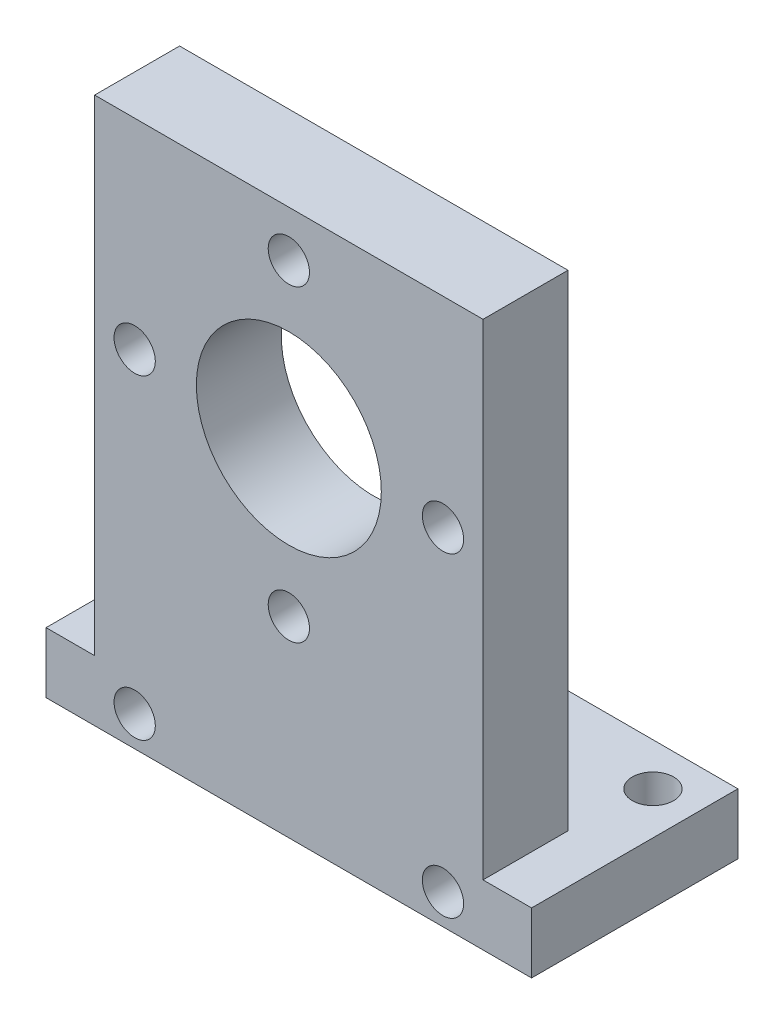
ISO-10303-21;
HEADER;
FILE_DESCRIPTION(('STEP AP214'),'2;1');
FILE_NAME('part.step','',(''),(''),'','','');
FILE_SCHEMA(('AUTOMOTIVE_DESIGN { 1 0 10303 214 1 1 1 1 }'));
ENDSEC;
DATA;
#1=APPLICATION_CONTEXT('core data for automotive mechanical design processes');
#2=APPLICATION_PROTOCOL_DEFINITION('international standard','automotive_design',2000,#1);
#3=PRODUCT_CONTEXT('',#1,'mechanical');
#4=PRODUCT('Part','Part','',(#3));
#5=PRODUCT_RELATED_PRODUCT_CATEGORY('part','',(#4));
#6=PRODUCT_DEFINITION_FORMATION('','',#4);
#7=PRODUCT_DEFINITION_CONTEXT('part definition',#1,'design');
#8=PRODUCT_DEFINITION('design','',#6,#7);
#9=PRODUCT_DEFINITION_SHAPE('','',#8);
#10=(LENGTH_UNIT() NAMED_UNIT(*) SI_UNIT(.MILLI.,.METRE.));
#11=(NAMED_UNIT(*) PLANE_ANGLE_UNIT() SI_UNIT($,.RADIAN.));
#12=(NAMED_UNIT(*) SI_UNIT($,.STERADIAN.) SOLID_ANGLE_UNIT());
#13=UNCERTAINTY_MEASURE_WITH_UNIT(LENGTH_MEASURE(1.E-05),#10,'distance_accuracy_value','');
#14=(GEOMETRIC_REPRESENTATION_CONTEXT(3) GLOBAL_UNCERTAINTY_ASSIGNED_CONTEXT((#13)) GLOBAL_UNIT_ASSIGNED_CONTEXT((#10,
#11,#12)) REPRESENTATION_CONTEXT('',''));
#15=CARTESIAN_POINT('',(0.,0.,0.));
#16=DIRECTION('',(0.,0.,1.));
#17=DIRECTION('',(1.,0.,0.));
#18=AXIS2_PLACEMENT_3D('',#15,#16,#17);
#19=CARTESIAN_POINT('',(-20.,5.,-13.5));
#20=DIRECTION('',(0.,0.,1.));
#21=DIRECTION('',(-1.,0.,0.));
#22=AXIS2_PLACEMENT_3D('',#19,#20,#21);
#23=PLANE('',#22);
#24=DIRECTION('',(1.,0.,0.));
#25=VECTOR('',#24,1.);
#26=CARTESIAN_POINT('',(-20.,0.,-13.5));
#27=LINE('',#26,#25);
#28=CARTESIAN_POINT('',(-20.,0.,-13.5));
#29=VERTEX_POINT('',#28);
#30=CARTESIAN_POINT('',(20.,0.,-13.5));
#31=VERTEX_POINT('',#30);
#32=EDGE_CURVE('E106',#29,#31,#27,.T.);
#33=ORIENTED_EDGE('',*,*,#32,.F.);
#34=DIRECTION('',(0.,-1.,0.));
#35=VECTOR('',#34,1.);
#36=CARTESIAN_POINT('',(-20.,5.,-13.5));
#37=LINE('',#36,#35);
#38=CARTESIAN_POINT('',(-20.,5.,-13.5));
#39=VERTEX_POINT('',#38);
#40=EDGE_CURVE('E70',#39,#29,#37,.T.);
#41=ORIENTED_EDGE('',*,*,#40,.F.);
#42=DIRECTION('',(1.,0.,0.));
#43=VECTOR('',#42,1.);
#44=CARTESIAN_POINT('',(-20.,5.,-13.5));
#45=LINE('',#44,#43);
#46=CARTESIAN_POINT('',(20.,5.,-13.5));
#47=VERTEX_POINT('',#46);
#48=EDGE_CURVE('E111',#39,#47,#45,.T.);
#49=ORIENTED_EDGE('',*,*,#48,.T.);
#50=DIRECTION('',(0.,-1.,0.));
#51=VECTOR('',#50,1.);
#52=CARTESIAN_POINT('',(20.,5.,-13.5));
#53=LINE('',#52,#51);
#54=EDGE_CURVE('E12',#47,#31,#53,.T.);
#55=ORIENTED_EDGE('',*,*,#54,.T.);
#56=EDGE_LOOP('',(#33,#41,#49,#55));
#57=FACE_BOUND('',#56,.T.);
#58=ADVANCED_FACE('F63',(#57),#23,.F.);
#59=CARTESIAN_POINT('',(20.,5.,13.5));
#60=DIRECTION('',(1.,0.,0.));
#61=DIRECTION('',(0.,0.,1.));
#62=AXIS2_PLACEMENT_3D('',#59,#60,#61);
#63=PLANE('',#62);
#64=DIRECTION('',(0.,1.,0.));
#65=VECTOR('',#64,1.);
#66=CARTESIAN_POINT('',(20.,-0.00100000000000013,3.5));
#67=LINE('',#66,#65);
#68=CARTESIAN_POINT('',(20.,0.,3.5));
#69=VERTEX_POINT('',#68);
#70=CARTESIAN_POINT('',(20.,5.,3.5));
#71=VERTEX_POINT('',#70);
#72=EDGE_CURVE('E199',#69,#71,#67,.T.);
#73=ORIENTED_EDGE('',*,*,#72,.F.);
#74=DIRECTION('',(0.,0.,-1.));
#75=VECTOR('',#74,1.);
#76=CARTESIAN_POINT('',(20.,0.,13.5));
#77=LINE('',#76,#75);
#78=EDGE_CURVE('E112',#69,#31,#77,.T.);
#79=ORIENTED_EDGE('',*,*,#78,.T.);
#80=ORIENTED_EDGE('',*,*,#54,.F.);
#81=DIRECTION('',(0.,0.,-1.));
#82=VECTOR('',#81,1.);
#83=CARTESIAN_POINT('',(20.,5.,13.5));
#84=LINE('',#83,#82);
#85=EDGE_CURVE('E127',#71,#47,#84,.T.);
#86=ORIENTED_EDGE('',*,*,#85,.F.);
#87=EDGE_LOOP('',(#73,#79,#80,#86));
#88=FACE_BOUND('',#87,.T.);
#89=ADVANCED_FACE('F236',(#88),#63,.T.);
#90=CARTESIAN_POINT('',(-20.,5.,13.5));
#91=DIRECTION('',(1.,0.,0.));
#92=DIRECTION('',(0.,0.,1.));
#93=AXIS2_PLACEMENT_3D('',#90,#91,#92);
#94=PLANE('',#93);
#95=DIRECTION('',(0.,0.,-1.));
#96=VECTOR('',#95,1.);
#97=CARTESIAN_POINT('',(-20.,5.,13.5));
#98=LINE('',#97,#96);
#99=CARTESIAN_POINT('',(-20.,5.,3.5));
#100=VERTEX_POINT('',#99);
#101=EDGE_CURVE('E86',#100,#39,#98,.T.);
#102=ORIENTED_EDGE('',*,*,#101,.T.);
#103=ORIENTED_EDGE('',*,*,#40,.T.);
#104=DIRECTION('',(0.,0.,-1.));
#105=VECTOR('',#104,1.);
#106=CARTESIAN_POINT('',(-20.,0.,13.5));
#107=LINE('',#106,#105);
#108=CARTESIAN_POINT('',(-20.,0.,3.5));
#109=VERTEX_POINT('',#108);
#110=EDGE_CURVE('E101',#109,#29,#107,.T.);
#111=ORIENTED_EDGE('',*,*,#110,.F.);
#112=DIRECTION('',(0.,1.,0.));
#113=VECTOR('',#112,1.);
#114=CARTESIAN_POINT('',(-20.,-0.00100000000000013,3.5));
#115=LINE('',#114,#113);
#116=EDGE_CURVE('E200',#109,#100,#115,.T.);
#117=ORIENTED_EDGE('',*,*,#116,.T.);
#118=EDGE_LOOP('',(#102,#103,#111,#117));
#119=FACE_BOUND('',#118,.T.);
#120=ADVANCED_FACE('F115',(#119),#94,.F.);
#121=CARTESIAN_POINT('',(0.,5.,0.));
#122=DIRECTION('',(0.,-1.,0.));
#123=DIRECTION('',(0.,0.,1.));
#124=AXIS2_PLACEMENT_3D('',#121,#122,#123);
#125=PLANE('',#124);
#126=CARTESIAN_POINT('',(16.5,5.,-10.));
#127=DIRECTION('',(0.,-1.,0.));
#128=DIRECTION('',(0.,0.,1.));
#129=AXIS2_PLACEMENT_3D('',#126,#127,#128);
#130=CIRCLE('',#129,1.7);
#131=CARTESIAN_POINT('',(16.5,5.,-8.3));
#132=VERTEX_POINT('',#131);
#133=EDGE_CURVE('E187',#132,#132,#130,.T.);
#134=ORIENTED_EDGE('',*,*,#133,.T.);
#135=EDGE_LOOP('',(#134));
#136=FACE_BOUND('',#135,.T.);
#137=CARTESIAN_POINT('',(-16.5,5.,-10.));
#138=DIRECTION('',(0.,-1.,0.));
#139=DIRECTION('',(0.,0.,-1.));
#140=AXIS2_PLACEMENT_3D('',#137,#138,#139);
#141=CIRCLE('',#140,1.7);
#142=CARTESIAN_POINT('',(-16.5,5.,-11.7));
#143=VERTEX_POINT('',#142);
#144=EDGE_CURVE('E193',#143,#143,#141,.T.);
#145=ORIENTED_EDGE('',*,*,#144,.T.);
#146=EDGE_LOOP('',(#145));
#147=FACE_BOUND('',#146,.T.);
#148=ORIENTED_EDGE('',*,*,#85,.T.);
#149=ORIENTED_EDGE('',*,*,#48,.F.);
#150=ORIENTED_EDGE('',*,*,#101,.F.);
#151=DIRECTION('',(1.,0.,0.));
#152=VECTOR('',#151,1.);
#153=CARTESIAN_POINT('',(-20.,5.,3.5));
#154=LINE('',#153,#152);
#155=CARTESIAN_POINT('',(-16.,5.,3.5));
#156=VERTEX_POINT('',#155);
#157=EDGE_CURVE('E202',#100,#156,#154,.T.);
#158=ORIENTED_EDGE('',*,*,#157,.T.);
#159=DIRECTION('',(0.,0.,-1.));
#160=VECTOR('',#159,1.);
#161=CARTESIAN_POINT('',(-16.,5.,0.));
#162=LINE('',#161,#160);
#163=CARTESIAN_POINT('',(-16.,5.,-3.5));
#164=VERTEX_POINT('',#163);
#165=EDGE_CURVE('E123',#156,#164,#162,.T.);
#166=ORIENTED_EDGE('',*,*,#165,.T.);
#167=DIRECTION('',(1.,0.,0.));
#168=VECTOR('',#167,1.);
#169=CARTESIAN_POINT('',(0.,5.,-3.5));
#170=LINE('',#169,#168);
#171=CARTESIAN_POINT('',(16.,5.00000000000001,-3.5));
#172=VERTEX_POINT('',#171);
#173=EDGE_CURVE('E119',#164,#172,#170,.T.);
#174=ORIENTED_EDGE('',*,*,#173,.T.);
#175=DIRECTION('',(0.,0.,-1.));
#176=VECTOR('',#175,1.);
#177=CARTESIAN_POINT('',(16.,5.,0.));
#178=LINE('',#177,#176);
#179=CARTESIAN_POINT('',(16.,5.,3.5));
#180=VERTEX_POINT('',#179);
#181=EDGE_CURVE('E132',#180,#172,#178,.T.);
#182=ORIENTED_EDGE('',*,*,#181,.F.);
#183=EDGE_CURVE('E207',#180,#71,#154,.T.);
#184=ORIENTED_EDGE('',*,*,#183,.T.);
#185=EDGE_LOOP('',(#148,#149,#150,#158,#166,#174,#182,#184));
#186=FACE_BOUND('',#185,.T.);
#187=ADVANCED_FACE('F227',(#136,#147,#186),#125,.F.);
#188=CARTESIAN_POINT('',(0.,0.,0.));
#189=DIRECTION('',(0.,-1.,0.));
#190=DIRECTION('',(0.,0.,1.));
#191=AXIS2_PLACEMENT_3D('',#188,#189,#190);
#192=PLANE('',#191);
#193=DIRECTION('',(1.,0.,0.));
#194=VECTOR('',#193,1.);
#195=CARTESIAN_POINT('',(-20.,0.,3.5));
#196=LINE('',#195,#194);
#197=EDGE_CURVE('E109',#109,#69,#196,.T.);
#198=ORIENTED_EDGE('',*,*,#197,.F.);
#199=ORIENTED_EDGE('',*,*,#110,.T.);
#200=ORIENTED_EDGE('',*,*,#32,.T.);
#201=ORIENTED_EDGE('',*,*,#78,.F.);
#202=EDGE_LOOP('',(#198,#199,#200,#201));
#203=FACE_BOUND('',#202,.T.);
#204=CARTESIAN_POINT('',(16.5,0.,-10.));
#205=DIRECTION('',(0.,1.,0.));
#206=DIRECTION('',(0.,0.,1.));
#207=AXIS2_PLACEMENT_3D('',#204,#205,#206);
#208=CIRCLE('',#207,1.7);
#209=CARTESIAN_POINT('',(16.5,0.,-8.3));
#210=VERTEX_POINT('',#209);
#211=EDGE_CURVE('E190',#210,#210,#208,.F.);
#212=ORIENTED_EDGE('',*,*,#211,.F.);
#213=EDGE_LOOP('',(#212));
#214=FACE_BOUND('',#213,.T.);
#215=CARTESIAN_POINT('',(-16.5,0.,-10.));
#216=DIRECTION('',(0.,1.,0.));
#217=DIRECTION('',(0.,0.,1.));
#218=AXIS2_PLACEMENT_3D('',#215,#216,#217);
#219=CIRCLE('',#218,1.7);
#220=CARTESIAN_POINT('',(-16.5,0.,-8.30000000000001));
#221=VERTEX_POINT('',#220);
#222=EDGE_CURVE('E167',#221,#221,#219,.F.);
#223=ORIENTED_EDGE('',*,*,#222,.F.);
#224=EDGE_LOOP('',(#223));
#225=FACE_BOUND('',#224,.T.);
#226=ADVANCED_FACE('F102',(#203,#214,#225),#192,.T.);
#227=CARTESIAN_POINT('',(0.,45.,3.5));
#228=DIRECTION('',(0.,0.,1.));
#229=DIRECTION('',(-1.,0.,0.));
#230=AXIS2_PLACEMENT_3D('',#227,#228,#229);
#231=PLANE('',#230);
#232=CARTESIAN_POINT('',(12.7000000000002,2.5,3.5));
#233=DIRECTION('',(0.,0.,-1.));
#234=DIRECTION('',(-1.,0.,0.));
#235=AXIS2_PLACEMENT_3D('',#232,#233,#234);
#236=CIRCLE('',#235,1.7);
#237=CARTESIAN_POINT('',(11.0000000000002,2.5,3.5));
#238=VERTEX_POINT('',#237);
#239=EDGE_CURVE('E214',#238,#238,#236,.T.);
#240=ORIENTED_EDGE('',*,*,#239,.T.);
#241=EDGE_LOOP('',(#240));
#242=FACE_BOUND('',#241,.T.);
#243=CARTESIAN_POINT('',(-12.7000000000002,2.5,3.5));
#244=DIRECTION('',(0.,0.,-1.));
#245=DIRECTION('',(1.,0.,0.));
#246=AXIS2_PLACEMENT_3D('',#243,#244,#245);
#247=CIRCLE('',#246,1.7);
#248=CARTESIAN_POINT('',(-11.0000000000002,2.5,3.5));
#249=VERTEX_POINT('',#248);
#250=EDGE_CURVE('E211',#249,#249,#247,.T.);
#251=ORIENTED_EDGE('',*,*,#250,.T.);
#252=EDGE_LOOP('',(#251));
#253=FACE_BOUND('',#252,.T.);
#254=CARTESIAN_POINT('',(0.,41.2,3.5));
#255=DIRECTION('',(0.,0.,-1.));
#256=DIRECTION('',(-1.,0.,0.));
#257=AXIS2_PLACEMENT_3D('',#254,#255,#256);
#258=CIRCLE('',#257,1.7);
#259=CARTESIAN_POINT('',(-1.7,41.2,3.5));
#260=VERTEX_POINT('',#259);
#261=EDGE_CURVE('E182',#260,#260,#258,.F.);
#262=ORIENTED_EDGE('',*,*,#261,.F.);
#263=EDGE_LOOP('',(#262));
#264=FACE_BOUND('',#263,.T.);
#265=CARTESIAN_POINT('',(12.7000000000002,28.5000000000001,3.5));
#266=DIRECTION('',(0.,0.,-1.));
#267=DIRECTION('',(-1.,0.,0.));
#268=AXIS2_PLACEMENT_3D('',#265,#266,#267);
#269=CIRCLE('',#268,1.7);
#270=CARTESIAN_POINT('',(11.0000000000002,28.5000000000001,3.5));
#271=VERTEX_POINT('',#270);
#272=EDGE_CURVE('E179',#271,#271,#269,.F.);
#273=ORIENTED_EDGE('',*,*,#272,.F.);
#274=EDGE_LOOP('',(#273));
#275=FACE_BOUND('',#274,.T.);
#276=CARTESIAN_POINT('',(2.66516243803523E-13,15.8,3.5));
#277=DIRECTION('',(0.,0.,-1.));
#278=DIRECTION('',(-1.,0.,0.));
#279=AXIS2_PLACEMENT_3D('',#276,#277,#278);
#280=CIRCLE('',#279,1.7);
#281=CARTESIAN_POINT('',(-1.69999999999973,15.8,3.5));
#282=VERTEX_POINT('',#281);
#283=EDGE_CURVE('E173',#282,#282,#280,.F.);
#284=ORIENTED_EDGE('',*,*,#283,.F.);
#285=EDGE_LOOP('',(#284));
#286=FACE_BOUND('',#285,.T.);
#287=CARTESIAN_POINT('',(-12.6999999999998,28.5,3.5));
#288=DIRECTION('',(0.,0.,-1.));
#289=DIRECTION('',(-1.,0.,0.));
#290=AXIS2_PLACEMENT_3D('',#287,#288,#289);
#291=CIRCLE('',#290,1.7);
#292=CARTESIAN_POINT('',(-14.3999999999998,28.5,3.5));
#293=VERTEX_POINT('',#292);
#294=EDGE_CURVE('E166',#293,#293,#291,.F.);
#295=ORIENTED_EDGE('',*,*,#294,.F.);
#296=EDGE_LOOP('',(#295));
#297=FACE_BOUND('',#296,.T.);
#298=CARTESIAN_POINT('',(0.,28.5,3.5));
#299=DIRECTION('',(0.,0.,-1.));
#300=DIRECTION('',(-1.,0.,0.));
#301=AXIS2_PLACEMENT_3D('',#298,#299,#300);
#302=CIRCLE('',#301,7.62);
#303=CARTESIAN_POINT('',(-7.62,28.5,3.5));
#304=VERTEX_POINT('',#303);
#305=EDGE_CURVE('E157',#304,#304,#302,.F.);
#306=ORIENTED_EDGE('',*,*,#305,.F.);
#307=EDGE_LOOP('',(#306));
#308=FACE_BOUND('',#307,.T.);
#309=DIRECTION('',(0.,-1.,0.));
#310=VECTOR('',#309,1.);
#311=CARTESIAN_POINT('',(16.,45.,3.5));
#312=LINE('',#311,#310);
#313=CARTESIAN_POINT('',(16.,45.,3.5));
#314=VERTEX_POINT('',#313);
#315=EDGE_CURVE('E135',#314,#180,#312,.T.);
#316=ORIENTED_EDGE('',*,*,#315,.F.);
#317=DIRECTION('',(1.,0.,0.));
#318=VECTOR('',#317,1.);
#319=CARTESIAN_POINT('',(0.,45.,3.5));
#320=LINE('',#319,#318);
#321=CARTESIAN_POINT('',(-16.,45.,3.5));
#322=VERTEX_POINT('',#321);
#323=EDGE_CURVE('E150',#322,#314,#320,.T.);
#324=ORIENTED_EDGE('',*,*,#323,.F.);
#325=DIRECTION('',(0.,-1.,0.));
#326=VECTOR('',#325,1.);
#327=CARTESIAN_POINT('',(-16.,45.,3.5));
#328=LINE('',#327,#326);
#329=EDGE_CURVE('E138',#322,#156,#328,.T.);
#330=ORIENTED_EDGE('',*,*,#329,.T.);
#331=ORIENTED_EDGE('',*,*,#157,.F.);
#332=ORIENTED_EDGE('',*,*,#116,.F.);
#333=ORIENTED_EDGE('',*,*,#197,.T.);
#334=ORIENTED_EDGE('',*,*,#72,.T.);
#335=ORIENTED_EDGE('',*,*,#183,.F.);
#336=EDGE_LOOP('',(#316,#324,#330,#331,#332,#333,#334,#335));
#337=FACE_BOUND('',#336,.T.);
#338=ADVANCED_FACE('F237',(#242,#253,#264,#275,#286,#297,#308,#337),#231,.T.);
#339=CARTESIAN_POINT('',(0.,45.,-3.5));
#340=DIRECTION('',(0.,0.,1.));
#341=DIRECTION('',(-1.,0.,0.));
#342=AXIS2_PLACEMENT_3D('',#339,#340,#341);
#343=PLANE('',#342);
#344=CARTESIAN_POINT('',(0.,41.2,-3.5));
#345=DIRECTION('',(0.,0.,1.));
#346=DIRECTION('',(1.,0.,0.));
#347=AXIS2_PLACEMENT_3D('',#344,#345,#346);
#348=CIRCLE('',#347,1.7);
#349=CARTESIAN_POINT('',(1.7,41.2,-3.5));
#350=VERTEX_POINT('',#349);
#351=EDGE_CURVE('E160',#350,#350,#348,.T.);
#352=ORIENTED_EDGE('',*,*,#351,.T.);
#353=EDGE_LOOP('',(#352));
#354=FACE_BOUND('',#353,.T.);
#355=CARTESIAN_POINT('',(12.7000000000002,28.5000000000001,-3.5));
#356=DIRECTION('',(0.,0.,1.));
#357=DIRECTION('',(1.,0.,0.));
#358=AXIS2_PLACEMENT_3D('',#355,#356,#357);
#359=CIRCLE('',#358,1.7);
#360=CARTESIAN_POINT('',(14.4000000000002,28.5000000000001,-3.5));
#361=VERTEX_POINT('',#360);
#362=EDGE_CURVE('E176',#361,#361,#359,.T.);
#363=ORIENTED_EDGE('',*,*,#362,.T.);
#364=EDGE_LOOP('',(#363));
#365=FACE_BOUND('',#364,.T.);
#366=CARTESIAN_POINT('',(2.66516243803523E-13,15.8,-3.5));
#367=DIRECTION('',(0.,0.,1.));
#368=DIRECTION('',(1.,0.,0.));
#369=AXIS2_PLACEMENT_3D('',#366,#367,#368);
#370=CIRCLE('',#369,1.7);
#371=CARTESIAN_POINT('',(1.70000000000027,15.8,-3.5));
#372=VERTEX_POINT('',#371);
#373=EDGE_CURVE('E170',#372,#372,#370,.T.);
#374=ORIENTED_EDGE('',*,*,#373,.T.);
#375=EDGE_LOOP('',(#374));
#376=FACE_BOUND('',#375,.T.);
#377=CARTESIAN_POINT('',(-12.6999999999998,28.5,-3.5));
#378=DIRECTION('',(0.,0.,1.));
#379=DIRECTION('',(1.,0.,0.));
#380=AXIS2_PLACEMENT_3D('',#377,#378,#379);
#381=CIRCLE('',#380,1.7);
#382=CARTESIAN_POINT('',(-10.9999999999998,28.5,-3.5));
#383=VERTEX_POINT('',#382);
#384=EDGE_CURVE('E163',#383,#383,#381,.T.);
#385=ORIENTED_EDGE('',*,*,#384,.T.);
#386=EDGE_LOOP('',(#385));
#387=FACE_BOUND('',#386,.T.);
#388=CARTESIAN_POINT('',(0.,28.5,-3.5));
#389=DIRECTION('',(0.,0.,1.));
#390=DIRECTION('',(1.,0.,0.));
#391=AXIS2_PLACEMENT_3D('',#388,#389,#390);
#392=CIRCLE('',#391,7.62);
#393=CARTESIAN_POINT('',(7.62,28.5,-3.5));
#394=VERTEX_POINT('',#393);
#395=EDGE_CURVE('E156',#394,#394,#392,.T.);
#396=ORIENTED_EDGE('',*,*,#395,.T.);
#397=EDGE_LOOP('',(#396));
#398=FACE_BOUND('',#397,.T.);
#399=DIRECTION('',(0.,-1.,0.));
#400=VECTOR('',#399,1.);
#401=CARTESIAN_POINT('',(-16.,45.,-3.5));
#402=LINE('',#401,#400);
#403=CARTESIAN_POINT('',(-16.,45.,-3.5));
#404=VERTEX_POINT('',#403);
#405=EDGE_CURVE('E77',#404,#164,#402,.T.);
#406=ORIENTED_EDGE('',*,*,#405,.F.);
#407=DIRECTION('',(1.,0.,0.));
#408=VECTOR('',#407,1.);
#409=CARTESIAN_POINT('',(0.,45.,-3.5));
#410=LINE('',#409,#408);
#411=CARTESIAN_POINT('',(16.,45.,-3.5));
#412=VERTEX_POINT('',#411);
#413=EDGE_CURVE('E145',#404,#412,#410,.T.);
#414=ORIENTED_EDGE('',*,*,#413,.T.);
#415=DIRECTION('',(0.,-1.,0.));
#416=VECTOR('',#415,1.);
#417=CARTESIAN_POINT('',(16.,45.,-3.5));
#418=LINE('',#417,#416);
#419=EDGE_CURVE('E142',#412,#172,#418,.T.);
#420=ORIENTED_EDGE('',*,*,#419,.T.);
#421=ORIENTED_EDGE('',*,*,#173,.F.);
#422=EDGE_LOOP('',(#406,#414,#420,#421));
#423=FACE_BOUND('',#422,.T.);
#424=ADVANCED_FACE('F259',(#354,#365,#376,#387,#398,#423),#343,.F.);
#425=CARTESIAN_POINT('',(16.,45.,0.));
#426=DIRECTION('',(1.,0.,0.));
#427=DIRECTION('',(0.,0.,1.));
#428=AXIS2_PLACEMENT_3D('',#425,#426,#427);
#429=PLANE('',#428);
#430=ORIENTED_EDGE('',*,*,#181,.T.);
#431=ORIENTED_EDGE('',*,*,#419,.F.);
#432=DIRECTION('',(0.,0.,-1.));
#433=VECTOR('',#432,1.);
#434=CARTESIAN_POINT('',(16.,45.,0.));
#435=LINE('',#434,#433);
#436=EDGE_CURVE('E153',#314,#412,#435,.T.);
#437=ORIENTED_EDGE('',*,*,#436,.F.);
#438=ORIENTED_EDGE('',*,*,#315,.T.);
#439=EDGE_LOOP('',(#430,#431,#437,#438));
#440=FACE_BOUND('',#439,.T.);
#441=ADVANCED_FACE('F263',(#440),#429,.T.);
#442=CARTESIAN_POINT('',(-16.,45.,0.));
#443=DIRECTION('',(1.,0.,0.));
#444=DIRECTION('',(0.,0.,1.));
#445=AXIS2_PLACEMENT_3D('',#442,#443,#444);
#446=PLANE('',#445);
#447=ORIENTED_EDGE('',*,*,#329,.F.);
#448=DIRECTION('',(0.,0.,-1.));
#449=VECTOR('',#448,1.);
#450=CARTESIAN_POINT('',(-16.,45.,0.));
#451=LINE('',#450,#449);
#452=EDGE_CURVE('E148',#322,#404,#451,.T.);
#453=ORIENTED_EDGE('',*,*,#452,.T.);
#454=ORIENTED_EDGE('',*,*,#405,.T.);
#455=ORIENTED_EDGE('',*,*,#165,.F.);
#456=EDGE_LOOP('',(#447,#453,#454,#455));
#457=FACE_BOUND('',#456,.T.);
#458=ADVANCED_FACE('F256',(#457),#446,.F.);
#459=CARTESIAN_POINT('',(0.,45.,0.));
#460=DIRECTION('',(0.,1.,0.));
#461=DIRECTION('',(0.,0.,-1.));
#462=AXIS2_PLACEMENT_3D('',#459,#460,#461);
#463=PLANE('',#462);
#464=ORIENTED_EDGE('',*,*,#436,.T.);
#465=ORIENTED_EDGE('',*,*,#413,.F.);
#466=ORIENTED_EDGE('',*,*,#452,.F.);
#467=ORIENTED_EDGE('',*,*,#323,.T.);
#468=EDGE_LOOP('',(#464,#465,#466,#467));
#469=FACE_BOUND('',#468,.T.);
#470=ADVANCED_FACE('F265',(#469),#463,.T.);
#471=CARTESIAN_POINT('',(0.,28.5,13.501));
#472=DIRECTION('',(0.,0.,-1.));
#473=DIRECTION('',(1.,0.,0.));
#474=AXIS2_PLACEMENT_3D('',#471,#472,#473);
#475=CYLINDRICAL_SURFACE('',#474,7.62);
#476=ORIENTED_EDGE('',*,*,#305,.T.);
#477=EDGE_LOOP('',(#476));
#478=FACE_BOUND('',#477,.T.);
#479=ORIENTED_EDGE('',*,*,#395,.F.);
#480=EDGE_LOOP('',(#479));
#481=FACE_BOUND('',#480,.T.);
#482=ADVANCED_FACE('F267',(#478,#481),#475,.F.);
#483=CARTESIAN_POINT('',(-12.6999999999998,28.5,13.501));
#484=DIRECTION('',(0.,0.,-1.));
#485=DIRECTION('',(1.,0.,0.));
#486=AXIS2_PLACEMENT_3D('',#483,#484,#485);
#487=CYLINDRICAL_SURFACE('',#486,1.7);
#488=ORIENTED_EDGE('',*,*,#294,.T.);
#489=EDGE_LOOP('',(#488));
#490=FACE_BOUND('',#489,.T.);
#491=ORIENTED_EDGE('',*,*,#384,.F.);
#492=EDGE_LOOP('',(#491));
#493=FACE_BOUND('',#492,.T.);
#494=ADVANCED_FACE('F273',(#490,#493),#487,.F.);
#495=CARTESIAN_POINT('',(2.66516243803523E-13,15.8,13.501));
#496=DIRECTION('',(0.,0.,-1.));
#497=DIRECTION('',(1.,0.,0.));
#498=AXIS2_PLACEMENT_3D('',#495,#496,#497);
#499=CYLINDRICAL_SURFACE('',#498,1.7);
#500=ORIENTED_EDGE('',*,*,#283,.T.);
#501=EDGE_LOOP('',(#500));
#502=FACE_BOUND('',#501,.T.);
#503=ORIENTED_EDGE('',*,*,#373,.F.);
#504=EDGE_LOOP('',(#503));
#505=FACE_BOUND('',#504,.T.);
#506=ADVANCED_FACE('F312',(#502,#505),#499,.F.);
#507=CARTESIAN_POINT('',(12.7000000000002,28.5000000000001,13.501));
#508=DIRECTION('',(0.,0.,-1.));
#509=DIRECTION('',(1.,0.,0.));
#510=AXIS2_PLACEMENT_3D('',#507,#508,#509);
#511=CYLINDRICAL_SURFACE('',#510,1.7);
#512=ORIENTED_EDGE('',*,*,#272,.T.);
#513=EDGE_LOOP('',(#512));
#514=FACE_BOUND('',#513,.T.);
#515=ORIENTED_EDGE('',*,*,#362,.F.);
#516=EDGE_LOOP('',(#515));
#517=FACE_BOUND('',#516,.T.);
#518=ADVANCED_FACE('F318',(#514,#517),#511,.F.);
#519=CARTESIAN_POINT('',(0.,41.2,13.501));
#520=DIRECTION('',(0.,0.,-1.));
#521=DIRECTION('',(1.,0.,0.));
#522=AXIS2_PLACEMENT_3D('',#519,#520,#521);
#523=CYLINDRICAL_SURFACE('',#522,1.7);
#524=ORIENTED_EDGE('',*,*,#261,.T.);
#525=EDGE_LOOP('',(#524));
#526=FACE_BOUND('',#525,.T.);
#527=ORIENTED_EDGE('',*,*,#351,.F.);
#528=EDGE_LOOP('',(#527));
#529=FACE_BOUND('',#528,.T.);
#530=ADVANCED_FACE('F324',(#526,#529),#523,.F.);
#531=CARTESIAN_POINT('',(-16.5,-0.00100000000000013,-10.));
#532=DIRECTION('',(0.,1.,0.));
#533=DIRECTION('',(0.,0.,-1.));
#534=AXIS2_PLACEMENT_3D('',#531,#532,#533);
#535=CYLINDRICAL_SURFACE('',#534,1.7);
#536=ORIENTED_EDGE('',*,*,#222,.T.);
#537=EDGE_LOOP('',(#536));
#538=FACE_BOUND('',#537,.T.);
#539=ORIENTED_EDGE('',*,*,#144,.F.);
#540=EDGE_LOOP('',(#539));
#541=FACE_BOUND('',#540,.T.);
#542=ADVANCED_FACE('F328',(#538,#541),#535,.F.);
#543=CARTESIAN_POINT('',(16.5,-0.00100000000000013,-10.));
#544=DIRECTION('',(0.,1.,0.));
#545=DIRECTION('',(0.,0.,-1.));
#546=AXIS2_PLACEMENT_3D('',#543,#544,#545);
#547=CYLINDRICAL_SURFACE('',#546,1.7);
#548=ORIENTED_EDGE('',*,*,#211,.T.);
#549=EDGE_LOOP('',(#548));
#550=FACE_BOUND('',#549,.T.);
#551=ORIENTED_EDGE('',*,*,#133,.F.);
#552=EDGE_LOOP('',(#551));
#553=FACE_BOUND('',#552,.T.);
#554=ADVANCED_FACE('F330',(#550,#553),#547,.F.);
#555=CARTESIAN_POINT('',(-12.7000000000002,2.5,-2.85));
#556=DIRECTION('',(0.,0.,1.));
#557=DIRECTION('',(-1.,0.,0.));
#558=AXIS2_PLACEMENT_3D('',#555,#556,#557);
#559=CYLINDRICAL_SURFACE('',#558,1.7);
#560=CARTESIAN_POINT('',(-12.7000000000002,2.5,-2.85));
#561=DIRECTION('',(0.,0.,-1.));
#562=DIRECTION('',(1.,0.,0.));
#563=AXIS2_PLACEMENT_3D('',#560,#561,#562);
#564=CIRCLE('',#563,1.7);
#565=CARTESIAN_POINT('',(-11.0000000000002,2.5,-2.85));
#566=VERTEX_POINT('',#565);
#567=EDGE_CURVE('E208',#566,#566,#564,.T.);
#568=ORIENTED_EDGE('',*,*,#567,.T.);
#569=EDGE_LOOP('',(#568));
#570=FACE_BOUND('',#569,.T.);
#571=ORIENTED_EDGE('',*,*,#250,.F.);
#572=EDGE_LOOP('',(#571));
#573=FACE_BOUND('',#572,.T.);
#574=ADVANCED_FACE('F333',(#570,#573),#559,.F.);
#575=CARTESIAN_POINT('',(-12.7000000000002,2.5,-2.85));
#576=DIRECTION('',(0.,0.,-1.));
#577=DIRECTION('',(1.,0.,0.));
#578=AXIS2_PLACEMENT_3D('',#575,#576,#577);
#579=PLANE('',#578);
#580=ORIENTED_EDGE('',*,*,#567,.F.);
#581=EDGE_LOOP('',(#580));
#582=FACE_BOUND('',#581,.T.);
#583=ADVANCED_FACE('F338',(#582),#579,.F.);
#584=CARTESIAN_POINT('',(12.7000000000002,2.5,-2.85));
#585=DIRECTION('',(0.,0.,1.));
#586=DIRECTION('',(-1.,0.,0.));
#587=AXIS2_PLACEMENT_3D('',#584,#585,#586);
#588=CYLINDRICAL_SURFACE('',#587,1.7);
#589=CARTESIAN_POINT('',(12.7000000000002,2.5,-2.85));
#590=DIRECTION('',(0.,0.,-1.));
#591=DIRECTION('',(-1.,0.,0.));
#592=AXIS2_PLACEMENT_3D('',#589,#590,#591);
#593=CIRCLE('',#592,1.7);
#594=CARTESIAN_POINT('',(11.0000000000002,2.5,-2.85));
#595=VERTEX_POINT('',#594);
#596=EDGE_CURVE('E217',#595,#595,#593,.T.);
#597=ORIENTED_EDGE('',*,*,#596,.T.);
#598=EDGE_LOOP('',(#597));
#599=FACE_BOUND('',#598,.T.);
#600=ORIENTED_EDGE('',*,*,#239,.F.);
#601=EDGE_LOOP('',(#600));
#602=FACE_BOUND('',#601,.T.);
#603=ADVANCED_FACE('F341',(#599,#602),#588,.F.);
#604=CARTESIAN_POINT('',(12.7000000000002,2.5,-2.85));
#605=DIRECTION('',(0.,0.,1.));
#606=DIRECTION('',(-1.,0.,0.));
#607=AXIS2_PLACEMENT_3D('',#604,#605,#606);
#608=PLANE('',#607);
#609=ORIENTED_EDGE('',*,*,#596,.F.);
#610=EDGE_LOOP('',(#609));
#611=FACE_BOUND('',#610,.T.);
#612=ADVANCED_FACE('F348',(#611),#608,.T.);
#613=CLOSED_SHELL('',(#58,#89,#120,#187,#226,#338,#424,#441,#458,#470,#482,#494,#506,#518,#530,
#542,#554,#574,#583,#603,#612));
#614=MANIFOLD_SOLID_BREP('B2',#613);
#615=ADVANCED_BREP_SHAPE_REPRESENTATION('',(#18,#614),#14);
#616=SHAPE_DEFINITION_REPRESENTATION(#9,#615);
ENDSEC;
END-ISO-10303-21;
